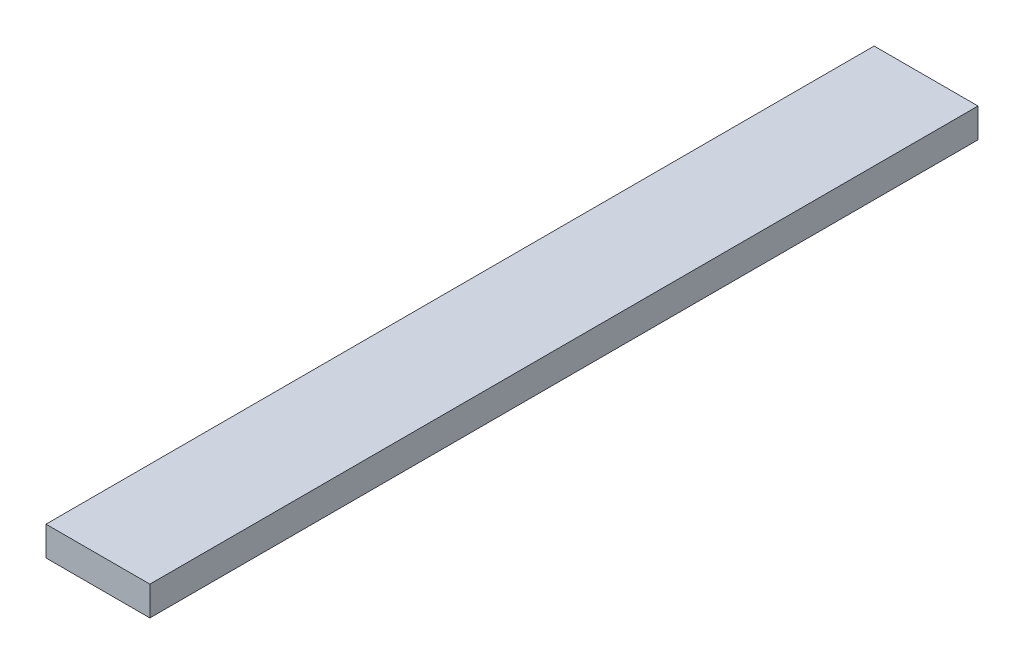
ISO-10303-21;
HEADER;
FILE_DESCRIPTION(('STEP AP214'),'2;1');
FILE_NAME('part.step','',(''),(''),'','','');
FILE_SCHEMA(('AUTOMOTIVE_DESIGN { 1 0 10303 214 1 1 1 1 }'));
ENDSEC;
DATA;
#1=APPLICATION_CONTEXT('core data for automotive mechanical design processes');
#2=APPLICATION_PROTOCOL_DEFINITION('international standard','automotive_design',2000,#1);
#3=PRODUCT_CONTEXT('',#1,'mechanical');
#4=PRODUCT('Part','Part','',(#3));
#5=PRODUCT_RELATED_PRODUCT_CATEGORY('part','',(#4));
#6=PRODUCT_DEFINITION_FORMATION('','',#4);
#7=PRODUCT_DEFINITION_CONTEXT('part definition',#1,'design');
#8=PRODUCT_DEFINITION('design','',#6,#7);
#9=PRODUCT_DEFINITION_SHAPE('','',#8);
#10=(LENGTH_UNIT() NAMED_UNIT(*) SI_UNIT(.MILLI.,.METRE.));
#11=(NAMED_UNIT(*) PLANE_ANGLE_UNIT() SI_UNIT($,.RADIAN.));
#12=(NAMED_UNIT(*) SI_UNIT($,.STERADIAN.) SOLID_ANGLE_UNIT());
#13=UNCERTAINTY_MEASURE_WITH_UNIT(LENGTH_MEASURE(1.E-05),#10,'distance_accuracy_value','');
#14=(GEOMETRIC_REPRESENTATION_CONTEXT(3) GLOBAL_UNCERTAINTY_ASSIGNED_CONTEXT((#13)) GLOBAL_UNIT_ASSIGNED_CONTEXT((#10,
#11,#12)) REPRESENTATION_CONTEXT('',''));
#15=CARTESIAN_POINT('',(0.,0.,0.));
#16=DIRECTION('',(0.,0.,1.));
#17=DIRECTION('',(1.,0.,0.));
#18=AXIS2_PLACEMENT_3D('',#15,#16,#17);
#19=CARTESIAN_POINT('',(0.,0.,358.775));
#20=DIRECTION('',(1.,0.,0.));
#21=DIRECTION('',(0.,0.,-1.));
#22=AXIS2_PLACEMENT_3D('',#19,#20,#21);
#23=PLANE('',#22);
#24=DIRECTION('',(0.,-1.,0.));
#25=VECTOR('',#24,1.);
#26=CARTESIAN_POINT('',(0.,0.,0.));
#27=LINE('',#26,#25);
#28=CARTESIAN_POINT('',(0.,12.7,0.));
#29=VERTEX_POINT('',#28);
#30=CARTESIAN_POINT('',(0.,0.,0.));
#31=VERTEX_POINT('',#30);
#32=EDGE_CURVE('E111',#29,#31,#27,.T.);
#33=ORIENTED_EDGE('',*,*,#32,.T.);
#34=DIRECTION('',(0.,0.,-1.));
#35=VECTOR('',#34,1.);
#36=CARTESIAN_POINT('',(0.,0.,358.775));
#37=LINE('',#36,#35);
#38=CARTESIAN_POINT('',(0.,0.,358.775));
#39=VERTEX_POINT('',#38);
#40=EDGE_CURVE('E11',#39,#31,#37,.T.);
#41=ORIENTED_EDGE('',*,*,#40,.F.);
#42=DIRECTION('',(0.,-1.,0.));
#43=VECTOR('',#42,1.);
#44=CARTESIAN_POINT('',(0.,0.,358.775));
#45=LINE('',#44,#43);
#46=CARTESIAN_POINT('',(0.,12.7,358.775));
#47=VERTEX_POINT('',#46);
#48=EDGE_CURVE('E95',#47,#39,#45,.T.);
#49=ORIENTED_EDGE('',*,*,#48,.F.);
#50=DIRECTION('',(0.,0.,-1.));
#51=VECTOR('',#50,1.);
#52=CARTESIAN_POINT('',(0.,12.7,358.775));
#53=LINE('',#52,#51);
#54=EDGE_CURVE('E107',#47,#29,#53,.T.);
#55=ORIENTED_EDGE('',*,*,#54,.T.);
#56=EDGE_LOOP('',(#33,#41,#49,#55));
#57=FACE_BOUND('',#56,.T.);
#58=ADVANCED_FACE('F43',(#57),#23,.F.);
#59=CARTESIAN_POINT('',(0.,0.,358.775));
#60=DIRECTION('',(0.,1.,0.));
#61=DIRECTION('',(0.,0.,1.));
#62=AXIS2_PLACEMENT_3D('',#59,#60,#61);
#63=PLANE('',#62);
#64=DIRECTION('',(1.,0.,0.));
#65=VECTOR('',#64,1.);
#66=CARTESIAN_POINT('',(0.,0.,0.));
#67=LINE('',#66,#65);
#68=CARTESIAN_POINT('',(45.,0.,0.));
#69=VERTEX_POINT('',#68);
#70=EDGE_CURVE('E100',#31,#69,#67,.T.);
#71=ORIENTED_EDGE('',*,*,#70,.T.);
#72=DIRECTION('',(0.,0.,-1.));
#73=VECTOR('',#72,1.);
#74=CARTESIAN_POINT('',(45.,0.,358.775));
#75=LINE('',#74,#73);
#76=CARTESIAN_POINT('',(45.,0.,358.775));
#77=VERTEX_POINT('',#76);
#78=EDGE_CURVE('E52',#77,#69,#75,.T.);
#79=ORIENTED_EDGE('',*,*,#78,.F.);
#80=DIRECTION('',(1.,0.,0.));
#81=VECTOR('',#80,1.);
#82=CARTESIAN_POINT('',(0.,0.,358.775));
#83=LINE('',#82,#81);
#84=EDGE_CURVE('E90',#39,#77,#83,.T.);
#85=ORIENTED_EDGE('',*,*,#84,.F.);
#86=ORIENTED_EDGE('',*,*,#40,.T.);
#87=EDGE_LOOP('',(#71,#79,#85,#86));
#88=FACE_BOUND('',#87,.T.);
#89=ADVANCED_FACE('F99',(#88),#63,.F.);
#90=CARTESIAN_POINT('',(45.,0.,358.775));
#91=DIRECTION('',(-1.,0.,0.));
#92=DIRECTION('',(0.,0.,1.));
#93=AXIS2_PLACEMENT_3D('',#90,#91,#92);
#94=PLANE('',#93);
#95=DIRECTION('',(0.,1.,0.));
#96=VECTOR('',#95,1.);
#97=CARTESIAN_POINT('',(45.,0.,0.));
#98=LINE('',#97,#96);
#99=CARTESIAN_POINT('',(45.,12.7,0.));
#100=VERTEX_POINT('',#99);
#101=EDGE_CURVE('E77',#69,#100,#98,.T.);
#102=ORIENTED_EDGE('',*,*,#101,.T.);
#103=DIRECTION('',(0.,0.,-1.));
#104=VECTOR('',#103,1.);
#105=CARTESIAN_POINT('',(45.,12.7,358.775));
#106=LINE('',#105,#104);
#107=CARTESIAN_POINT('',(45.,12.7,358.775));
#108=VERTEX_POINT('',#107);
#109=EDGE_CURVE('E102',#108,#100,#106,.T.);
#110=ORIENTED_EDGE('',*,*,#109,.F.);
#111=DIRECTION('',(0.,1.,0.));
#112=VECTOR('',#111,1.);
#113=CARTESIAN_POINT('',(45.,0.,358.775));
#114=LINE('',#113,#112);
#115=EDGE_CURVE('E93',#77,#108,#114,.T.);
#116=ORIENTED_EDGE('',*,*,#115,.F.);
#117=ORIENTED_EDGE('',*,*,#78,.T.);
#118=EDGE_LOOP('',(#102,#110,#116,#117));
#119=FACE_BOUND('',#118,.T.);
#120=ADVANCED_FACE('F103',(#119),#94,.F.);
#121=CARTESIAN_POINT('',(0.,12.7,358.775));
#122=DIRECTION('',(0.,-1.,0.));
#123=DIRECTION('',(0.,0.,-1.));
#124=AXIS2_PLACEMENT_3D('',#121,#122,#123);
#125=PLANE('',#124);
#126=DIRECTION('',(-1.,0.,0.));
#127=VECTOR('',#126,1.);
#128=CARTESIAN_POINT('',(0.,12.7,0.));
#129=LINE('',#128,#127);
#130=EDGE_CURVE('E83',#100,#29,#129,.T.);
#131=ORIENTED_EDGE('',*,*,#130,.T.);
#132=ORIENTED_EDGE('',*,*,#54,.F.);
#133=DIRECTION('',(-1.,0.,0.));
#134=VECTOR('',#133,1.);
#135=CARTESIAN_POINT('',(0.,12.7,358.775));
#136=LINE('',#135,#134);
#137=EDGE_CURVE('E60',#108,#47,#136,.T.);
#138=ORIENTED_EDGE('',*,*,#137,.F.);
#139=ORIENTED_EDGE('',*,*,#109,.T.);
#140=EDGE_LOOP('',(#131,#132,#138,#139));
#141=FACE_BOUND('',#140,.T.);
#142=ADVANCED_FACE('F124',(#141),#125,.F.);
#143=CARTESIAN_POINT('',(0.,0.,358.775));
#144=DIRECTION('',(0.,0.,-1.));
#145=DIRECTION('',(-1.,0.,0.));
#146=AXIS2_PLACEMENT_3D('',#143,#144,#145);
#147=PLANE('',#146);
#148=ORIENTED_EDGE('',*,*,#48,.T.);
#149=ORIENTED_EDGE('',*,*,#84,.T.);
#150=ORIENTED_EDGE('',*,*,#115,.T.);
#151=ORIENTED_EDGE('',*,*,#137,.T.);
#152=EDGE_LOOP('',(#148,#149,#150,#151));
#153=FACE_BOUND('',#152,.T.);
#154=ADVANCED_FACE('F91',(#153),#147,.F.);
#155=CARTESIAN_POINT('',(0.,0.,0.));
#156=DIRECTION('',(0.,0.,-1.));
#157=DIRECTION('',(-1.,0.,0.));
#158=AXIS2_PLACEMENT_3D('',#155,#156,#157);
#159=PLANE('',#158);
#160=ORIENTED_EDGE('',*,*,#32,.F.);
#161=ORIENTED_EDGE('',*,*,#130,.F.);
#162=ORIENTED_EDGE('',*,*,#101,.F.);
#163=ORIENTED_EDGE('',*,*,#70,.F.);
#164=EDGE_LOOP('',(#160,#161,#162,#163));
#165=FACE_BOUND('',#164,.T.);
#166=ADVANCED_FACE('F127',(#165),#159,.T.);
#167=CLOSED_SHELL('',(#58,#89,#120,#142,#154,#166));
#168=MANIFOLD_SOLID_BREP('B2',#167);
#169=ADVANCED_BREP_SHAPE_REPRESENTATION('',(#18,#168),#14);
#170=SHAPE_DEFINITION_REPRESENTATION(#9,#169);
ENDSEC;
END-ISO-10303-21;
